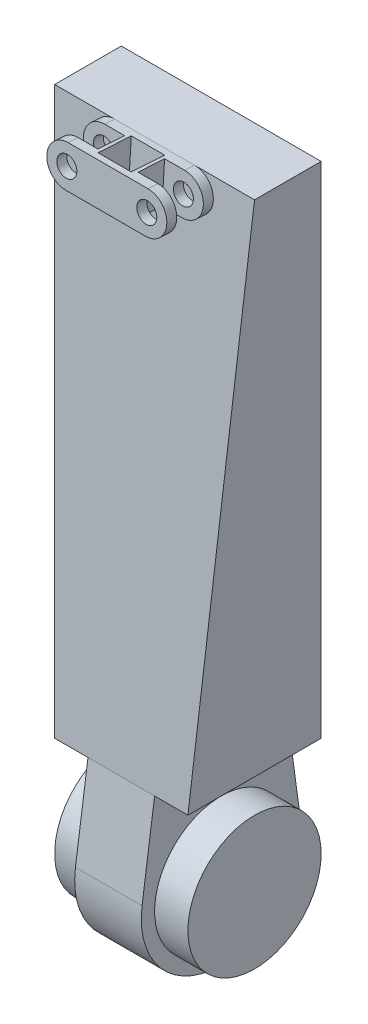
ISO-10303-21;
HEADER;
FILE_DESCRIPTION(('STEP AP214'),'2;1');
FILE_NAME('part.step','',(''),(''),'','','');
FILE_SCHEMA(('AUTOMOTIVE_DESIGN { 1 0 10303 214 1 1 1 1 }'));
ENDSEC;
DATA;
#1=APPLICATION_CONTEXT('core data for automotive mechanical design processes');
#2=APPLICATION_PROTOCOL_DEFINITION('international standard','automotive_design',2000,#1);
#3=PRODUCT_CONTEXT('',#1,'mechanical');
#4=PRODUCT('Part','Part','',(#3));
#5=PRODUCT_RELATED_PRODUCT_CATEGORY('part','',(#4));
#6=PRODUCT_DEFINITION_FORMATION('','',#4);
#7=PRODUCT_DEFINITION_CONTEXT('part definition',#1,'design');
#8=PRODUCT_DEFINITION('design','',#6,#7);
#9=PRODUCT_DEFINITION_SHAPE('','',#8);
#10=(LENGTH_UNIT() NAMED_UNIT(*) SI_UNIT(.MILLI.,.METRE.));
#11=(NAMED_UNIT(*) PLANE_ANGLE_UNIT() SI_UNIT($,.RADIAN.));
#12=(NAMED_UNIT(*) SI_UNIT($,.STERADIAN.) SOLID_ANGLE_UNIT());
#13=UNCERTAINTY_MEASURE_WITH_UNIT(LENGTH_MEASURE(1.E-05),#10,'distance_accuracy_value','');
#14=(GEOMETRIC_REPRESENTATION_CONTEXT(3) GLOBAL_UNCERTAINTY_ASSIGNED_CONTEXT((#13)) GLOBAL_UNIT_ASSIGNED_CONTEXT((#10,
#11,#12)) REPRESENTATION_CONTEXT('',''));
#15=CARTESIAN_POINT('',(0.,0.,0.));
#16=DIRECTION('',(0.,0.,1.));
#17=DIRECTION('',(1.,0.,0.));
#18=AXIS2_PLACEMENT_3D('',#15,#16,#17);
#19=CARTESIAN_POINT('',(6.,37.4424902676376,12.1735029078458));
#20=DIRECTION('',(0.,-0.0623782861551805,-0.998052578482889));
#21=DIRECTION('',(0.,0.998052578482889,-0.0623782861551805));
#22=AXIS2_PLACEMENT_3D('',#19,#20,#21);
#23=CYLINDRICAL_SURFACE('',#22,3.00000000000001);
#24=DIRECTION('',(0.,-0.0623782861551805,-0.998052578482889));
#25=VECTOR('',#24,1.);
#26=CARTESIAN_POINT('',(6.,34.4483325321889,12.3606377663113));
#27=LINE('',#26,#25);
#28=CARTESIAN_POINT('',(6.,34.4483325321889,12.3606377663113));
#29=VERTEX_POINT('',#28);
#30=CARTESIAN_POINT('',(6.,34.3547651029562,10.863558898587));
#31=VERTEX_POINT('',#30);
#32=EDGE_CURVE('E360',#29,#31,#27,.T.);
#33=ORIENTED_EDGE('',*,*,#32,.T.);
#34=CARTESIAN_POINT('',(6.,37.3489228384048,10.6764240401214));
#35=DIRECTION('',(0.,0.0623782861551805,0.998052578482889));
#36=DIRECTION('',(0.,-0.998052578482889,0.0623782861551805));
#37=AXIS2_PLACEMENT_3D('',#34,#35,#36);
#38=CIRCLE('',#37,3.00000000000001);
#39=CARTESIAN_POINT('',(6.,40.3430805738535,10.4892891816559));
#40=VERTEX_POINT('',#39);
#41=EDGE_CURVE('E323',#31,#40,#38,.T.);
#42=ORIENTED_EDGE('',*,*,#41,.T.);
#43=DIRECTION('',(0.,-0.0623782861551805,-0.998052578482889));
#44=VECTOR('',#43,1.);
#45=CARTESIAN_POINT('',(6.,40.4366480030863,11.9863680493802));
#46=LINE('',#45,#44);
#47=CARTESIAN_POINT('',(6.,40.4366480030863,11.9863680493802));
#48=VERTEX_POINT('',#47);
#49=EDGE_CURVE('E379',#48,#40,#46,.T.);
#50=ORIENTED_EDGE('',*,*,#49,.F.);
#51=CARTESIAN_POINT('',(6.,37.4424902676376,12.1735029078458));
#52=DIRECTION('',(0.,0.0623782861551805,0.998052578482889));
#53=DIRECTION('',(0.,-0.998052578482889,0.0623782861551805));
#54=AXIS2_PLACEMENT_3D('',#51,#52,#53);
#55=CIRCLE('',#54,3.00000000000001);
#56=EDGE_CURVE('E343',#29,#48,#55,.T.);
#57=ORIENTED_EDGE('',*,*,#56,.F.);
#58=EDGE_LOOP('',(#33,#42,#50,#57));
#59=FACE_BOUND('',#58,.T.);
#60=ADVANCED_FACE('F52',(#59),#23,.T.);
#61=CARTESIAN_POINT('',(-6.00000000000001,37.4424902676376,12.1735029078458));
#62=DIRECTION('',(0.,-0.0623782861551805,-0.998052578482889));
#63=DIRECTION('',(0.,0.998052578482889,-0.0623782861551805));
#64=AXIS2_PLACEMENT_3D('',#61,#62,#63);
#65=CYLINDRICAL_SURFACE('',#64,2.99999999999999);
#66=DIRECTION('',(0.,-0.0623782861551805,-0.998052578482889));
#67=VECTOR('',#66,1.);
#68=CARTESIAN_POINT('',(-6.00000000000001,34.4483325321889,12.3606377663113));
#69=LINE('',#68,#67);
#70=CARTESIAN_POINT('',(-6.00000000000001,34.1052519583355,6.87134858465542));
#71=VERTEX_POINT('',#70);
#72=CARTESIAN_POINT('',(-6.00000000000001,34.0116845291027,5.37426971693109));
#73=VERTEX_POINT('',#72);
#74=EDGE_CURVE('E364',#71,#73,#69,.T.);
#75=ORIENTED_EDGE('',*,*,#74,.F.);
#76=CARTESIAN_POINT('',(-6.00000000000001,37.0994096937841,6.68421372618988));
#77=DIRECTION('',(0.,-0.0623782861551805,-0.998052578482889));
#78=DIRECTION('',(0.,0.998052578482889,-0.0623782861551805));
#79=AXIS2_PLACEMENT_3D('',#76,#77,#78);
#80=CIRCLE('',#79,2.99999999999999);
#81=CARTESIAN_POINT('',(-6.,40.0935674292328,6.49707886772434));
#82=VERTEX_POINT('',#81);
#83=EDGE_CURVE('E331',#71,#82,#80,.T.);
#84=ORIENTED_EDGE('',*,*,#83,.T.);
#85=DIRECTION('',(0.,-0.0623782861551805,-0.998052578482889));
#86=VECTOR('',#85,1.);
#87=CARTESIAN_POINT('',(-6.00000000000001,40.4366480030863,11.9863680493802));
#88=LINE('',#87,#86);
#89=CARTESIAN_POINT('',(-6.00000000000001,40.,5.));
#90=VERTEX_POINT('',#89);
#91=EDGE_CURVE('E369',#82,#90,#88,.T.);
#92=ORIENTED_EDGE('',*,*,#91,.T.);
#93=CARTESIAN_POINT('',(-6.00000000000001,37.0058422645513,5.18713485846554));
#94=DIRECTION('',(0.,0.0623782861551805,0.998052578482889));
#95=DIRECTION('',(0.,-0.998052578482889,0.0623782861551805));
#96=AXIS2_PLACEMENT_3D('',#93,#94,#95);
#97=CIRCLE('',#96,2.99999999999999);
#98=EDGE_CURVE('E359',#90,#73,#97,.T.);
#99=ORIENTED_EDGE('',*,*,#98,.T.);
#100=EDGE_LOOP('',(#75,#84,#92,#99));
#101=FACE_BOUND('',#100,.T.);
#102=ADVANCED_FACE('F870',(#101),#65,.T.);
#103=CARTESIAN_POINT('',(6.,37.4424902676376,12.1735029078458));
#104=DIRECTION('',(0.,-0.0623782861551805,-0.998052578482889));
#105=DIRECTION('',(0.,0.998052578482889,-0.0623782861551805));
#106=AXIS2_PLACEMENT_3D('',#103,#104,#105);
#107=CYLINDRICAL_SURFACE('',#106,1.5);
#108=CARTESIAN_POINT('',(6.,37.3489228384048,10.6764240401214));
#109=DIRECTION('',(0.,0.0623782861551805,0.998052578482889));
#110=DIRECTION('',(0.,-0.998052578482889,0.0623782861551805));
#111=AXIS2_PLACEMENT_3D('',#108,#109,#110);
#112=CIRCLE('',#111,1.5);
#113=CARTESIAN_POINT('',(6.,35.8518439706805,10.7699914693542));
#114=VERTEX_POINT('',#113);
#115=EDGE_CURVE('E322',#114,#114,#112,.T.);
#116=ORIENTED_EDGE('',*,*,#115,.F.);
#117=EDGE_LOOP('',(#116));
#118=FACE_BOUND('',#117,.T.);
#119=CARTESIAN_POINT('',(6.,37.4424902676376,12.1735029078458));
#120=DIRECTION('',(0.,0.0623782861551805,0.998052578482889));
#121=DIRECTION('',(0.,-0.998052578482889,0.0623782861551805));
#122=AXIS2_PLACEMENT_3D('',#119,#120,#121);
#123=CIRCLE('',#122,1.5);
#124=CARTESIAN_POINT('',(6.,35.9454113999133,12.2670703370785));
#125=VERTEX_POINT('',#124);
#126=EDGE_CURVE('E334',#125,#125,#123,.T.);
#127=ORIENTED_EDGE('',*,*,#126,.T.);
#128=EDGE_LOOP('',(#127));
#129=FACE_BOUND('',#128,.T.);
#130=ADVANCED_FACE('F866',(#118,#129),#107,.F.);
#131=CARTESIAN_POINT('',(0.,-40.,0.));
#132=DIRECTION('',(0.,1.,0.));
#133=DIRECTION('',(0.,0.,1.));
#134=AXIS2_PLACEMENT_3D('',#131,#132,#133);
#135=PLANE('',#134);
#136=DIRECTION('',(0.,0.,1.));
#137=VECTOR('',#136,1.);
#138=CARTESIAN_POINT('',(5.,-40.,10.));
#139=LINE('',#138,#137);
#140=CARTESIAN_POINT('',(5.,-40.,-10.));
#141=VERTEX_POINT('',#140);
#142=CARTESIAN_POINT('',(5.,-40.,10.));
#143=VERTEX_POINT('',#142);
#144=EDGE_CURVE('E389',#141,#143,#139,.T.);
#145=ORIENTED_EDGE('',*,*,#144,.F.);
#146=DIRECTION('',(-1.,0.,0.));
#147=VECTOR('',#146,1.);
#148=CARTESIAN_POINT('',(-10.,-40.,-10.));
#149=LINE('',#148,#147);
#150=CARTESIAN_POINT('',(10.,-40.,-10.));
#151=VERTEX_POINT('',#150);
#152=EDGE_CURVE('E406',#151,#141,#149,.T.);
#153=ORIENTED_EDGE('',*,*,#152,.F.);
#154=DIRECTION('',(0.,0.,-1.));
#155=VECTOR('',#154,1.);
#156=CARTESIAN_POINT('',(10.,-40.,-10.));
#157=LINE('',#156,#155);
#158=CARTESIAN_POINT('',(10.,-40.,10.));
#159=VERTEX_POINT('',#158);
#160=EDGE_CURVE('E659',#159,#151,#157,.T.);
#161=ORIENTED_EDGE('',*,*,#160,.F.);
#162=DIRECTION('',(1.,0.,0.));
#163=VECTOR('',#162,1.);
#164=CARTESIAN_POINT('',(-10.,-40.,10.));
#165=LINE('',#164,#163);
#166=EDGE_CURVE('E533',#143,#159,#165,.T.);
#167=ORIENTED_EDGE('',*,*,#166,.F.);
#168=EDGE_LOOP('',(#145,#153,#161,#167));
#169=FACE_BOUND('',#168,.T.);
#170=ADVANCED_FACE('F1089',(#169),#135,.F.);
#171=CARTESIAN_POINT('',(-5.,-40.,-10.));
#172=VERTEX_POINT('',#171);
#173=CARTESIAN_POINT('',(-10.,-40.,-10.));
#174=VERTEX_POINT('',#173);
#175=EDGE_CURVE('E412',#172,#174,#149,.T.);
#176=ORIENTED_EDGE('',*,*,#175,.F.);
#177=DIRECTION('',(0.,0.,1.));
#178=VECTOR('',#177,1.);
#179=CARTESIAN_POINT('',(-5.,-40.,10.));
#180=LINE('',#179,#178);
#181=CARTESIAN_POINT('',(-5.,-40.,10.));
#182=VERTEX_POINT('',#181);
#183=EDGE_CURVE('E383',#172,#182,#180,.T.);
#184=ORIENTED_EDGE('',*,*,#183,.T.);
#185=CARTESIAN_POINT('',(-10.,-40.,10.));
#186=VERTEX_POINT('',#185);
#187=EDGE_CURVE('E667',#186,#182,#165,.T.);
#188=ORIENTED_EDGE('',*,*,#187,.F.);
#189=DIRECTION('',(0.,0.,1.));
#190=VECTOR('',#189,1.);
#191=CARTESIAN_POINT('',(-10.,-40.,-10.));
#192=LINE('',#191,#190);
#193=EDGE_CURVE('E429',#174,#186,#192,.T.);
#194=ORIENTED_EDGE('',*,*,#193,.F.);
#195=EDGE_LOOP('',(#176,#184,#188,#194));
#196=FACE_BOUND('',#195,.T.);
#197=ADVANCED_FACE('F54',(#196),#135,.F.);
#198=CARTESIAN_POINT('',(0.,40.,0.));
#199=DIRECTION('',(0.,1.,0.));
#200=DIRECTION('',(0.,0.,1.));
#201=AXIS2_PLACEMENT_3D('',#198,#199,#200);
#202=PLANE('',#201);
#203=DIRECTION('',(0.,0.,1.));
#204=VECTOR('',#203,1.);
#205=CARTESIAN_POINT('',(-15.,40.,5.));
#206=LINE('',#205,#204);
#207=CARTESIAN_POINT('',(-15.,40.,-5.));
#208=VERTEX_POINT('',#207);
#209=CARTESIAN_POINT('',(-15.,40.,5.));
#210=VERTEX_POINT('',#209);
#211=EDGE_CURVE('E402',#208,#210,#206,.T.);
#212=ORIENTED_EDGE('',*,*,#211,.T.);
#213=DIRECTION('',(1.,0.,0.));
#214=VECTOR('',#213,1.);
#215=CARTESIAN_POINT('',(15.,40.,5.));
#216=LINE('',#215,#214);
#217=EDGE_CURVE('E535',#210,#90,#216,.T.);
#218=ORIENTED_EDGE('',*,*,#217,.T.);
#219=DIRECTION('',(-1.,0.,0.));
#220=VECTOR('',#219,1.);
#221=CARTESIAN_POINT('',(6.,40.,5.));
#222=LINE('',#221,#220);
#223=CARTESIAN_POINT('',(6.,40.,5.));
#224=VERTEX_POINT('',#223);
#225=EDGE_CURVE('E586',#224,#90,#222,.T.);
#226=ORIENTED_EDGE('',*,*,#225,.F.);
#227=CARTESIAN_POINT('',(15.,40.,5.));
#228=VERTEX_POINT('',#227);
#229=EDGE_CURVE('E525',#224,#228,#216,.T.);
#230=ORIENTED_EDGE('',*,*,#229,.T.);
#231=DIRECTION('',(0.,0.,-1.));
#232=VECTOR('',#231,1.);
#233=CARTESIAN_POINT('',(15.,40.,5.));
#234=LINE('',#233,#232);
#235=CARTESIAN_POINT('',(15.,40.,-5.));
#236=VERTEX_POINT('',#235);
#237=EDGE_CURVE('E512',#228,#236,#234,.T.);
#238=ORIENTED_EDGE('',*,*,#237,.T.);
#239=DIRECTION('',(-1.,0.,0.));
#240=VECTOR('',#239,1.);
#241=CARTESIAN_POINT('',(15.,40.,-5.));
#242=LINE('',#241,#240);
#243=EDGE_CURVE('E526',#236,#208,#242,.T.);
#244=ORIENTED_EDGE('',*,*,#243,.T.);
#245=EDGE_LOOP('',(#212,#218,#226,#230,#238,#244));
#246=FACE_BOUND('',#245,.T.);
#247=ADVANCED_FACE('F716',(#246),#202,.T.);
#248=CARTESIAN_POINT('',(12.4513618677043,-0.778210116731518,0.));
#249=DIRECTION('',(0.998052578482889,-0.0623782861551806,0.));
#250=DIRECTION('',(0.0623782861551806,0.998052578482889,0.));
#251=AXIS2_PLACEMENT_3D('',#248,#249,#250);
#252=PLANE('',#251);
#253=DIRECTION('',(-0.0622572806364691,-0.996116490183505,0.062257280636469));
#254=VECTOR('',#253,1.);
#255=CARTESIAN_POINT('',(15.,40.,5.));
#256=LINE('',#255,#254);
#257=EDGE_CURVE('E505',#228,#159,#256,.T.);
#258=ORIENTED_EDGE('',*,*,#257,.T.);
#259=ORIENTED_EDGE('',*,*,#160,.T.);
#260=DIRECTION('',(-0.0622572806364691,-0.996116490183505,-0.062257280636469));
#261=VECTOR('',#260,1.);
#262=CARTESIAN_POINT('',(15.,40.,-5.));
#263=LINE('',#262,#261);
#264=EDGE_CURVE('E496',#236,#151,#263,.T.);
#265=ORIENTED_EDGE('',*,*,#264,.F.);
#266=ORIENTED_EDGE('',*,*,#237,.F.);
#267=EDGE_LOOP('',(#258,#259,#265,#266));
#268=FACE_BOUND('',#267,.T.);
#269=ADVANCED_FACE('F485',(#268),#252,.T.);
#270=CARTESIAN_POINT('',(0.,0.466926070038911,-7.47081712062257));
#271=DIRECTION('',(0.,0.0623782861551805,-0.998052578482889));
#272=DIRECTION('',(0.,0.998052578482889,0.0623782861551805));
#273=AXIS2_PLACEMENT_3D('',#270,#271,#272);
#274=PLANE('',#273);
#275=ORIENTED_EDGE('',*,*,#264,.T.);
#276=ORIENTED_EDGE('',*,*,#152,.T.);
#277=DIRECTION('',(-1.,0.,0.));
#278=VECTOR('',#277,1.);
#279=CARTESIAN_POINT('',(5.,-40.,-10.));
#280=LINE('',#279,#278);
#281=EDGE_CURVE('E434',#141,#172,#280,.T.);
#282=ORIENTED_EDGE('',*,*,#281,.T.);
#283=ORIENTED_EDGE('',*,*,#175,.T.);
#284=DIRECTION('',(0.062257280636469,-0.996116490183505,-0.0622572806364691));
#285=VECTOR('',#284,1.);
#286=CARTESIAN_POINT('',(-15.,40.,-5.));
#287=LINE('',#286,#285);
#288=EDGE_CURVE('E555',#208,#174,#287,.T.);
#289=ORIENTED_EDGE('',*,*,#288,.F.);
#290=ORIENTED_EDGE('',*,*,#243,.F.);
#291=EDGE_LOOP('',(#275,#276,#282,#283,#289,#290));
#292=FACE_BOUND('',#291,.T.);
#293=ADVANCED_FACE('F455',(#292),#274,.T.);
#294=CARTESIAN_POINT('',(0.,0.46692607003891,7.47081712062257));
#295=DIRECTION('',(0.,0.0623782861551805,0.998052578482889));
#296=DIRECTION('',(0.,-0.998052578482889,0.0623782861551805));
#297=AXIS2_PLACEMENT_3D('',#294,#295,#296);
#298=PLANE('',#297);
#299=ORIENTED_EDGE('',*,*,#229,.F.);
#300=CARTESIAN_POINT('',(6.,37.0058422645513,5.18713485846554));
#301=DIRECTION('',(0.,0.0623782861551805,0.998052578482889));
#302=DIRECTION('',(0.,-0.998052578482889,0.0623782861551805));
#303=AXIS2_PLACEMENT_3D('',#300,#301,#302);
#304=CIRCLE('',#303,3.00000000000001);
#305=CARTESIAN_POINT('',(6.,34.0116845291027,5.37426971693109));
#306=VERTEX_POINT('',#305);
#307=EDGE_CURVE('E342',#306,#224,#304,.T.);
#308=ORIENTED_EDGE('',*,*,#307,.F.);
#309=DIRECTION('',(1.,0.,0.));
#310=VECTOR('',#309,1.);
#311=CARTESIAN_POINT('',(6.,34.0116845291027,5.37426971693109));
#312=LINE('',#311,#310);
#313=EDGE_CURVE('E347',#73,#306,#312,.T.);
#314=ORIENTED_EDGE('',*,*,#313,.F.);
#315=ORIENTED_EDGE('',*,*,#98,.F.);
#316=ORIENTED_EDGE('',*,*,#217,.F.);
#317=DIRECTION('',(0.062257280636469,-0.996116490183505,0.062257280636469));
#318=VECTOR('',#317,1.);
#319=CARTESIAN_POINT('',(-15.,40.,5.));
#320=LINE('',#319,#318);
#321=EDGE_CURVE('E504',#210,#186,#320,.T.);
#322=ORIENTED_EDGE('',*,*,#321,.T.);
#323=ORIENTED_EDGE('',*,*,#187,.T.);
#324=DIRECTION('',(-1.,0.,0.));
#325=VECTOR('',#324,1.);
#326=CARTESIAN_POINT('',(5.,-40.,10.));
#327=LINE('',#326,#325);
#328=EDGE_CURVE('E398',#143,#182,#327,.T.);
#329=ORIENTED_EDGE('',*,*,#328,.F.);
#330=ORIENTED_EDGE('',*,*,#166,.T.);
#331=ORIENTED_EDGE('',*,*,#257,.F.);
#332=EDGE_LOOP('',(#299,#308,#314,#315,#316,#322,#323,#329,#330,#331));
#333=FACE_BOUND('',#332,.T.);
#334=ADVANCED_FACE('F484',(#333),#298,.T.);
#335=CARTESIAN_POINT('',(-12.4513618677043,-0.778210116731517,0.));
#336=DIRECTION('',(-0.998052578482889,-0.0623782861551805,0.));
#337=DIRECTION('',(0.0623782861551805,-0.998052578482889,0.));
#338=AXIS2_PLACEMENT_3D('',#335,#336,#337);
#339=PLANE('',#338);
#340=ORIENTED_EDGE('',*,*,#288,.T.);
#341=ORIENTED_EDGE('',*,*,#193,.T.);
#342=ORIENTED_EDGE('',*,*,#321,.F.);
#343=ORIENTED_EDGE('',*,*,#211,.F.);
#344=EDGE_LOOP('',(#340,#341,#342,#343));
#345=FACE_BOUND('',#344,.T.);
#346=ADVANCED_FACE('F556',(#345),#339,.T.);
#347=CARTESIAN_POINT('',(5.,-40.,10.));
#348=DIRECTION('',(0.,-0.13988849085927,-0.990167263711094));
#349=DIRECTION('',(0.,0.990167263711094,-0.13988849085927));
#350=AXIS2_PLACEMENT_3D('',#347,#348,#349);
#351=PLANE('',#350);
#352=DIRECTION('',(0.,-0.990167263711094,0.13988849085927));
#353=VECTOR('',#352,1.);
#354=CARTESIAN_POINT('',(-5.,-40.,10.));
#355=LINE('',#354,#353);
#356=CARTESIAN_POINT('',(-5.,-53.3213381096888,11.8820071645331));
#357=VERTEX_POINT('',#356);
#358=EDGE_CURVE('E694',#182,#357,#355,.T.);
#359=ORIENTED_EDGE('',*,*,#358,.T.);
#360=DIRECTION('',(-1.,0.,0.));
#361=VECTOR('',#360,1.);
#362=CARTESIAN_POINT('',(5.,-53.3213381096888,11.8820071645331));
#363=LINE('',#362,#361);
#364=CARTESIAN_POINT('',(5.,-53.3213381096888,11.8820071645331));
#365=VERTEX_POINT('',#364);
#366=EDGE_CURVE('E403',#365,#357,#363,.T.);
#367=ORIENTED_EDGE('',*,*,#366,.F.);
#368=DIRECTION('',(0.,-0.990167263711094,0.13988849085927));
#369=VECTOR('',#368,1.);
#370=CARTESIAN_POINT('',(5.,-40.,10.));
#371=LINE('',#370,#369);
#372=EDGE_CURVE('E394',#143,#365,#371,.T.);
#373=ORIENTED_EDGE('',*,*,#372,.F.);
#374=ORIENTED_EDGE('',*,*,#328,.T.);
#375=EDGE_LOOP('',(#359,#367,#373,#374));
#376=FACE_BOUND('',#375,.T.);
#377=ADVANCED_FACE('F564',(#376),#351,.F.);
#378=CARTESIAN_POINT('',(5.,-55.,0.));
#379=DIRECTION('',(-1.,0.,0.));
#380=DIRECTION('',(0.,0.,1.));
#381=AXIS2_PLACEMENT_3D('',#378,#379,#380);
#382=CYLINDRICAL_SURFACE('',#381,12.);
#383=CARTESIAN_POINT('',(-5.,-55.,0.));
#384=DIRECTION('',(1.,0.,0.));
#385=DIRECTION('',(0.,0.,-1.));
#386=AXIS2_PLACEMENT_3D('',#383,#384,#385);
#387=CIRCLE('',#386,12.);
#388=CARTESIAN_POINT('',(-5.,-52.0894958776771,-11.6416908460043));
#389=VERTEX_POINT('',#388);
#390=EDGE_CURVE('E697',#357,#389,#387,.T.);
#391=ORIENTED_EDGE('',*,*,#390,.T.);
#392=DIRECTION('',(-1.,0.,0.));
#393=VECTOR('',#392,1.);
#394=CARTESIAN_POINT('',(5.,-52.0894958776771,-11.6416908460043));
#395=LINE('',#394,#393);
#396=CARTESIAN_POINT('',(5.,-52.0894958776771,-11.6416908460043));
#397=VERTEX_POINT('',#396);
#398=EDGE_CURVE('E439',#397,#389,#395,.T.);
#399=ORIENTED_EDGE('',*,*,#398,.F.);
#400=CARTESIAN_POINT('',(5.,-55.,0.));
#401=DIRECTION('',(1.,0.,0.));
#402=DIRECTION('',(0.,0.,-1.));
#403=AXIS2_PLACEMENT_3D('',#400,#401,#402);
#404=CIRCLE('',#403,12.);
#405=EDGE_CURVE('E386',#365,#397,#404,.T.);
#406=ORIENTED_EDGE('',*,*,#405,.F.);
#407=ORIENTED_EDGE('',*,*,#366,.T.);
#408=EDGE_LOOP('',(#391,#399,#406,#407));
#409=FACE_BOUND('',#408,.T.);
#410=ADVANCED_FACE('F715',(#409),#382,.T.);
#411=CARTESIAN_POINT('',(5.,-40.,-10.));
#412=DIRECTION('',(0.,-0.13455982436795,0.990905471609712));
#413=DIRECTION('',(0.,-0.990905471609712,-0.13455982436795));
#414=AXIS2_PLACEMENT_3D('',#411,#412,#413);
#415=PLANE('',#414);
#416=DIRECTION('',(0.,0.990905471609712,0.13455982436795));
#417=VECTOR('',#416,1.);
#418=CARTESIAN_POINT('',(-5.,-40.,-10.));
#419=LINE('',#418,#417);
#420=EDGE_CURVE('E395',#389,#172,#419,.T.);
#421=ORIENTED_EDGE('',*,*,#420,.T.);
#422=ORIENTED_EDGE('',*,*,#281,.F.);
#423=DIRECTION('',(0.,0.990905471609712,0.13455982436795));
#424=VECTOR('',#423,1.);
#425=CARTESIAN_POINT('',(5.,-40.,-10.));
#426=LINE('',#425,#424);
#427=EDGE_CURVE('E413',#397,#141,#426,.T.);
#428=ORIENTED_EDGE('',*,*,#427,.F.);
#429=ORIENTED_EDGE('',*,*,#398,.T.);
#430=EDGE_LOOP('',(#421,#422,#428,#429));
#431=FACE_BOUND('',#430,.T.);
#432=ADVANCED_FACE('F447',(#431),#415,.F.);
#433=CARTESIAN_POINT('',(5.,-55.,0.));
#434=DIRECTION('',(1.,0.,0.));
#435=DIRECTION('',(0.,0.,-1.));
#436=AXIS2_PLACEMENT_3D('',#433,#434,#435);
#437=PLANE('',#436);
#438=CARTESIAN_POINT('',(5.,-55.,0.));
#439=DIRECTION('',(1.,0.,0.));
#440=DIRECTION('',(0.,0.,-1.));
#441=AXIS2_PLACEMENT_3D('',#438,#439,#440);
#442=CIRCLE('',#441,10.);
#443=CARTESIAN_POINT('',(5.,-55.,-10.));
#444=VERTEX_POINT('',#443);
#445=EDGE_CURVE('E374',#444,#444,#442,.F.);
#446=ORIENTED_EDGE('',*,*,#445,.T.);
#447=EDGE_LOOP('',(#446));
#448=FACE_BOUND('',#447,.T.);
#449=ORIENTED_EDGE('',*,*,#144,.T.);
#450=ORIENTED_EDGE('',*,*,#372,.T.);
#451=ORIENTED_EDGE('',*,*,#405,.T.);
#452=ORIENTED_EDGE('',*,*,#427,.T.);
#453=EDGE_LOOP('',(#449,#450,#451,#452));
#454=FACE_BOUND('',#453,.T.);
#455=ADVANCED_FACE('F1169',(#448,#454),#437,.T.);
#456=CARTESIAN_POINT('',(-5.,-55.,0.));
#457=DIRECTION('',(1.,0.,0.));
#458=DIRECTION('',(0.,0.,-1.));
#459=AXIS2_PLACEMENT_3D('',#456,#457,#458);
#460=PLANE('',#459);
#461=CARTESIAN_POINT('',(-5.,-55.,0.));
#462=DIRECTION('',(1.,0.,0.));
#463=DIRECTION('',(0.,0.,-1.));
#464=AXIS2_PLACEMENT_3D('',#461,#462,#463);
#465=CIRCLE('',#464,10.);
#466=CARTESIAN_POINT('',(-5.,-55.,-10.));
#467=VERTEX_POINT('',#466);
#468=EDGE_CURVE('E411',#467,#467,#465,.F.);
#469=ORIENTED_EDGE('',*,*,#468,.F.);
#470=EDGE_LOOP('',(#469));
#471=FACE_BOUND('',#470,.T.);
#472=ORIENTED_EDGE('',*,*,#183,.F.);
#473=ORIENTED_EDGE('',*,*,#420,.F.);
#474=ORIENTED_EDGE('',*,*,#390,.F.);
#475=ORIENTED_EDGE('',*,*,#358,.F.);
#476=EDGE_LOOP('',(#472,#473,#474,#475));
#477=FACE_BOUND('',#476,.T.);
#478=ADVANCED_FACE('F1159',(#471,#477),#460,.F.);
#479=CARTESIAN_POINT('',(-10.,-55.,0.));
#480=DIRECTION('',(1.,0.,0.));
#481=DIRECTION('',(0.,0.,-1.));
#482=AXIS2_PLACEMENT_3D('',#479,#480,#481);
#483=PLANE('',#482);
#484=CARTESIAN_POINT('',(-10.,-55.,0.));
#485=DIRECTION('',(1.,0.,0.));
#486=DIRECTION('',(0.,0.,-1.));
#487=AXIS2_PLACEMENT_3D('',#484,#485,#486);
#488=CIRCLE('',#487,10.);
#489=CARTESIAN_POINT('',(-10.,-55.,-10.));
#490=VERTEX_POINT('',#489);
#491=EDGE_CURVE('E375',#490,#490,#488,.T.);
#492=ORIENTED_EDGE('',*,*,#491,.F.);
#493=EDGE_LOOP('',(#492));
#494=FACE_BOUND('',#493,.T.);
#495=ADVANCED_FACE('F1150',(#494),#483,.F.);
#496=CARTESIAN_POINT('',(10.,-55.,0.));
#497=DIRECTION('',(-1.,0.,0.));
#498=DIRECTION('',(0.,0.,1.));
#499=AXIS2_PLACEMENT_3D('',#496,#497,#498);
#500=CYLINDRICAL_SURFACE('',#499,10.);
#501=ORIENTED_EDGE('',*,*,#491,.T.);
#502=EDGE_LOOP('',(#501));
#503=FACE_BOUND('',#502,.T.);
#504=ORIENTED_EDGE('',*,*,#468,.T.);
#505=EDGE_LOOP('',(#504));
#506=FACE_BOUND('',#505,.T.);
#507=ADVANCED_FACE('F1140',(#503,#506),#500,.T.);
#508=ORIENTED_EDGE('',*,*,#445,.F.);
#509=EDGE_LOOP('',(#508));
#510=FACE_BOUND('',#509,.T.);
#511=CARTESIAN_POINT('',(10.,-55.,0.));
#512=DIRECTION('',(1.,0.,0.));
#513=DIRECTION('',(0.,0.,-1.));
#514=AXIS2_PLACEMENT_3D('',#511,#512,#513);
#515=CIRCLE('',#514,10.);
#516=CARTESIAN_POINT('',(10.,-55.,-10.));
#517=VERTEX_POINT('',#516);
#518=EDGE_CURVE('E370',#517,#517,#515,.T.);
#519=ORIENTED_EDGE('',*,*,#518,.F.);
#520=EDGE_LOOP('',(#519));
#521=FACE_BOUND('',#520,.T.);
#522=ADVANCED_FACE('F1130',(#510,#521),#500,.T.);
#523=CARTESIAN_POINT('',(10.,-55.,0.));
#524=DIRECTION('',(1.,0.,0.));
#525=DIRECTION('',(0.,0.,-1.));
#526=AXIS2_PLACEMENT_3D('',#523,#524,#525);
#527=PLANE('',#526);
#528=ORIENTED_EDGE('',*,*,#518,.T.);
#529=EDGE_LOOP('',(#528));
#530=FACE_BOUND('',#529,.T.);
#531=ADVANCED_FACE('F887',(#530),#527,.T.);
#532=CARTESIAN_POINT('',(6.,37.4424902676376,12.1735029078458));
#533=DIRECTION('',(0.,0.0623782861551805,0.998052578482889));
#534=DIRECTION('',(0.,-0.998052578482889,0.0623782861551805));
#535=AXIS2_PLACEMENT_3D('',#532,#533,#534);
#536=PLANE('',#535);
#537=CARTESIAN_POINT('',(-6.00000000000001,37.4424902676376,12.1735029078458));
#538=DIRECTION('',(0.,0.0623782861551805,0.998052578482889));
#539=DIRECTION('',(0.,-0.998052578482889,0.0623782861551805));
#540=AXIS2_PLACEMENT_3D('',#537,#538,#539);
#541=CIRCLE('',#540,1.5);
#542=CARTESIAN_POINT('',(-6.00000000000001,35.9454113999133,12.2670703370785));
#543=VERTEX_POINT('',#542);
#544=EDGE_CURVE('E338',#543,#543,#541,.T.);
#545=ORIENTED_EDGE('',*,*,#544,.F.);
#546=EDGE_LOOP('',(#545));
#547=FACE_BOUND('',#546,.T.);
#548=ORIENTED_EDGE('',*,*,#56,.T.);
#549=DIRECTION('',(-1.,0.,0.));
#550=VECTOR('',#549,1.);
#551=CARTESIAN_POINT('',(6.,40.4366480030863,11.9863680493802));
#552=LINE('',#551,#550);
#553=CARTESIAN_POINT('',(-6.00000000000001,40.4366480030863,11.9863680493802));
#554=VERTEX_POINT('',#553);
#555=EDGE_CURVE('E346',#48,#554,#552,.T.);
#556=ORIENTED_EDGE('',*,*,#555,.T.);
#557=CARTESIAN_POINT('',(-6.00000000000001,37.4424902676376,12.1735029078458));
#558=DIRECTION('',(0.,0.0623782861551805,0.998052578482889));
#559=DIRECTION('',(0.,-0.998052578482889,0.0623782861551805));
#560=AXIS2_PLACEMENT_3D('',#557,#558,#559);
#561=CIRCLE('',#560,2.99999999999999);
#562=CARTESIAN_POINT('',(-6.00000000000001,34.4483325321889,12.3606377663113));
#563=VERTEX_POINT('',#562);
#564=EDGE_CURVE('E349',#554,#563,#561,.T.);
#565=ORIENTED_EDGE('',*,*,#564,.T.);
#566=DIRECTION('',(1.,0.,0.));
#567=VECTOR('',#566,1.);
#568=CARTESIAN_POINT('',(6.,34.4483325321889,12.3606377663113));
#569=LINE('',#568,#567);
#570=EDGE_CURVE('E352',#563,#29,#569,.T.);
#571=ORIENTED_EDGE('',*,*,#570,.T.);
#572=EDGE_LOOP('',(#548,#556,#565,#571));
#573=FACE_BOUND('',#572,.T.);
#574=ORIENTED_EDGE('',*,*,#126,.F.);
#575=EDGE_LOOP('',(#574));
#576=FACE_BOUND('',#575,.T.);
#577=ADVANCED_FACE('F882',(#547,#573,#576),#536,.T.);
#578=CARTESIAN_POINT('',(6.,40.0935674292328,6.49707886772434));
#579=VERTEX_POINT('',#578);
#580=EDGE_CURVE('E57',#579,#224,#46,.T.);
#581=ORIENTED_EDGE('',*,*,#580,.F.);
#582=CARTESIAN_POINT('',(6.,37.0994096937841,6.68421372618988));
#583=DIRECTION('',(0.,-0.0623782861551805,-0.998052578482889));
#584=DIRECTION('',(0.,0.998052578482889,-0.0623782861551805));
#585=AXIS2_PLACEMENT_3D('',#582,#583,#584);
#586=CIRCLE('',#585,3.00000000000001);
#587=CARTESIAN_POINT('',(6.,34.1052519583355,6.87134858465542));
#588=VERTEX_POINT('',#587);
#589=EDGE_CURVE('E319',#579,#588,#586,.T.);
#590=ORIENTED_EDGE('',*,*,#589,.T.);
#591=EDGE_CURVE('E355',#588,#306,#27,.T.);
#592=ORIENTED_EDGE('',*,*,#591,.T.);
#593=ORIENTED_EDGE('',*,*,#307,.T.);
#594=EDGE_LOOP('',(#581,#590,#592,#593));
#595=FACE_BOUND('',#594,.T.);
#596=ADVANCED_FACE('F873',(#595),#23,.T.);
#597=CARTESIAN_POINT('',(6.,40.4366480030863,11.9863680493802));
#598=DIRECTION('',(0.,-0.998052578482889,0.0623782861551805));
#599=DIRECTION('',(0.,-0.0623782861551805,-0.998052578482889));
#600=AXIS2_PLACEMENT_3D('',#597,#598,#599);
#601=PLANE('',#600);
#602=DIRECTION('',(-1.,0.,0.));
#603=VECTOR('',#602,1.);
#604=CARTESIAN_POINT('',(-2.50000000000009,40.0623782861552,5.9980525784829));
#605=LINE('',#604,#603);
#606=CARTESIAN_POINT('',(2.49999999999992,40.0623782861552,5.9980525784829));
#607=VERTEX_POINT('',#606);
#608=CARTESIAN_POINT('',(-2.50000000000009,40.0623782861552,5.9980525784829));
#609=VERTEX_POINT('',#608);
#610=EDGE_CURVE('E231',#607,#609,#605,.T.);
#611=ORIENTED_EDGE('',*,*,#610,.F.);
#612=DIRECTION('',(0.,-0.0623782861551805,-0.998052578482889));
#613=VECTOR('',#612,1.);
#614=CARTESIAN_POINT('',(2.49999999999991,40.3742697169311,10.9883154708973));
#615=LINE('',#614,#613);
#616=CARTESIAN_POINT('',(2.49999999999991,40.3742697169311,10.9883154708973));
#617=VERTEX_POINT('',#616);
#618=EDGE_CURVE('E72',#617,#607,#615,.T.);
#619=ORIENTED_EDGE('',*,*,#618,.F.);
#620=DIRECTION('',(1.,0.,0.));
#621=VECTOR('',#620,1.);
#622=CARTESIAN_POINT('',(-2.50000000000009,40.3742697169311,10.9883154708973));
#623=LINE('',#622,#621);
#624=CARTESIAN_POINT('',(-2.50000000000009,40.3742697169311,10.9883154708973));
#625=VERTEX_POINT('',#624);
#626=EDGE_CURVE('E239',#625,#617,#623,.T.);
#627=ORIENTED_EDGE('',*,*,#626,.F.);
#628=DIRECTION('',(0.,0.0623782861551805,0.998052578482889));
#629=VECTOR('',#628,1.);
#630=CARTESIAN_POINT('',(-2.50000000000009,40.3742697169311,10.9883154708973));
#631=LINE('',#630,#629);
#632=EDGE_CURVE('E221',#609,#625,#631,.T.);
#633=ORIENTED_EDGE('',*,*,#632,.F.);
#634=EDGE_LOOP('',(#611,#619,#627,#633));
#635=FACE_BOUND('',#634,.T.);
#636=ORIENTED_EDGE('',*,*,#49,.T.);
#637=DIRECTION('',(1.,0.,0.));
#638=VECTOR('',#637,1.);
#639=CARTESIAN_POINT('',(2.99999999999999,40.3430805738535,10.4892891816559));
#640=LINE('',#639,#638);
#641=CARTESIAN_POINT('',(2.99999999999999,40.3430805738535,10.4892891816559));
#642=VERTEX_POINT('',#641);
#643=EDGE_CURVE('E278',#642,#40,#640,.T.);
#644=ORIENTED_EDGE('',*,*,#643,.F.);
#645=DIRECTION('',(0.,0.0623782861551812,0.998052578482888));
#646=VECTOR('',#645,1.);
#647=CARTESIAN_POINT('',(2.99999999999999,40.3430805738535,10.4892891816559));
#648=LINE('',#647,#646);
#649=CARTESIAN_POINT('',(2.99999999999999,40.0935674292328,6.49707886772434));
#650=VERTEX_POINT('',#649);
#651=EDGE_CURVE('E273',#650,#642,#648,.T.);
#652=ORIENTED_EDGE('',*,*,#651,.F.);
#653=DIRECTION('',(-1.,0.,0.));
#654=VECTOR('',#653,1.);
#655=CARTESIAN_POINT('',(2.99999999999999,40.0935674292328,6.49707886772434));
#656=LINE('',#655,#654);
#657=EDGE_CURVE('E270',#579,#650,#656,.T.);
#658=ORIENTED_EDGE('',*,*,#657,.F.);
#659=ORIENTED_EDGE('',*,*,#580,.T.);
#660=ORIENTED_EDGE('',*,*,#225,.T.);
#661=ORIENTED_EDGE('',*,*,#91,.F.);
#662=DIRECTION('',(-1.,0.,0.));
#663=VECTOR('',#662,1.);
#664=CARTESIAN_POINT('',(-3.00000000000002,40.0935674292328,6.49707886772434));
#665=LINE('',#664,#663);
#666=CARTESIAN_POINT('',(-3.00000000000002,40.0935674292328,6.49707886772434));
#667=VERTEX_POINT('',#666);
#668=EDGE_CURVE('E306',#667,#82,#665,.T.);
#669=ORIENTED_EDGE('',*,*,#668,.F.);
#670=DIRECTION('',(0.,-0.0623782861551812,-0.998052578482889));
#671=VECTOR('',#670,1.);
#672=CARTESIAN_POINT('',(-3.00000000000002,40.3430805738535,10.4892891816559));
#673=LINE('',#672,#671);
#674=CARTESIAN_POINT('',(-3.00000000000002,40.3430805738535,10.4892891816559));
#675=VERTEX_POINT('',#674);
#676=EDGE_CURVE('E302',#675,#667,#673,.T.);
#677=ORIENTED_EDGE('',*,*,#676,.F.);
#678=DIRECTION('',(1.,0.,0.));
#679=VECTOR('',#678,1.);
#680=CARTESIAN_POINT('',(-3.00000000000002,40.3430805738535,10.4892891816559));
#681=LINE('',#680,#679);
#682=CARTESIAN_POINT('',(-6.,40.3430805738535,10.4892891816559));
#683=VERTEX_POINT('',#682);
#684=EDGE_CURVE('E259',#683,#675,#681,.T.);
#685=ORIENTED_EDGE('',*,*,#684,.F.);
#686=EDGE_CURVE('E602',#554,#683,#88,.T.);
#687=ORIENTED_EDGE('',*,*,#686,.F.);
#688=ORIENTED_EDGE('',*,*,#555,.F.);
#689=EDGE_LOOP('',(#636,#644,#652,#658,#659,#660,#661,#669,#677,#685,#687,#688));
#690=FACE_BOUND('',#689,.T.);
#691=ADVANCED_FACE('F236',(#635,#690),#601,.F.);
#692=ORIENTED_EDGE('',*,*,#686,.T.);
#693=CARTESIAN_POINT('',(-6.00000000000001,37.3489228384048,10.6764240401214));
#694=DIRECTION('',(0.,0.0623782861551805,0.998052578482889));
#695=DIRECTION('',(0.,-0.998052578482889,0.0623782861551805));
#696=AXIS2_PLACEMENT_3D('',#693,#694,#695);
#697=CIRCLE('',#696,2.99999999999999);
#698=CARTESIAN_POINT('',(-6.00000000000001,34.3547651029562,10.863558898587));
#699=VERTEX_POINT('',#698);
#700=EDGE_CURVE('E327',#683,#699,#697,.T.);
#701=ORIENTED_EDGE('',*,*,#700,.T.);
#702=EDGE_CURVE('E365',#563,#699,#69,.T.);
#703=ORIENTED_EDGE('',*,*,#702,.F.);
#704=ORIENTED_EDGE('',*,*,#564,.F.);
#705=EDGE_LOOP('',(#692,#701,#703,#704));
#706=FACE_BOUND('',#705,.T.);
#707=ADVANCED_FACE('F878',(#706),#65,.T.);
#708=CARTESIAN_POINT('',(6.,34.4483325321889,12.3606377663113));
#709=DIRECTION('',(0.,0.998052578482889,-0.0623782861551805));
#710=DIRECTION('',(0.,0.0623782861551805,0.998052578482889));
#711=AXIS2_PLACEMENT_3D('',#708,#709,#710);
#712=PLANE('',#711);
#713=DIRECTION('',(-1.,0.,0.));
#714=VECTOR('',#713,1.);
#715=CARTESIAN_POINT('',(-2.50000000000007,34.3859542460338,11.3625851878284));
#716=LINE('',#715,#714);
#717=CARTESIAN_POINT('',(2.49999999999993,34.3859542460338,11.3625851878284));
#718=VERTEX_POINT('',#717);
#719=CARTESIAN_POINT('',(-2.50000000000008,34.3859542460338,11.3625851878284));
#720=VERTEX_POINT('',#719);
#721=EDGE_CURVE('E841',#718,#720,#716,.T.);
#722=ORIENTED_EDGE('',*,*,#721,.F.);
#723=DIRECTION('',(0.,0.0623782861551805,0.998052578482889));
#724=VECTOR('',#723,1.);
#725=CARTESIAN_POINT('',(2.49999999999992,34.3859542460338,11.3625851878284));
#726=LINE('',#725,#724);
#727=CARTESIAN_POINT('',(2.49999999999992,34.0740628152579,6.37232229541398));
#728=VERTEX_POINT('',#727);
#729=EDGE_CURVE('E260',#728,#718,#726,.T.);
#730=ORIENTED_EDGE('',*,*,#729,.F.);
#731=DIRECTION('',(1.,0.,0.));
#732=VECTOR('',#731,1.);
#733=CARTESIAN_POINT('',(-2.50000000000007,34.0740628152579,6.37232229541398));
#734=LINE('',#733,#732);
#735=CARTESIAN_POINT('',(-2.50000000000009,34.0740628152579,6.37232229541398));
#736=VERTEX_POINT('',#735);
#737=EDGE_CURVE('E256',#736,#728,#734,.T.);
#738=ORIENTED_EDGE('',*,*,#737,.F.);
#739=DIRECTION('',(0.,-0.0623782861551805,-0.998052578482889));
#740=VECTOR('',#739,1.);
#741=CARTESIAN_POINT('',(-2.50000000000008,34.3859542460338,11.3625851878284));
#742=LINE('',#741,#740);
#743=EDGE_CURVE('E224',#720,#736,#742,.T.);
#744=ORIENTED_EDGE('',*,*,#743,.F.);
#745=EDGE_LOOP('',(#722,#730,#738,#744));
#746=FACE_BOUND('',#745,.T.);
#747=DIRECTION('',(0.,-0.0623782861551805,-0.998052578482889));
#748=VECTOR('',#747,1.);
#749=CARTESIAN_POINT('',(2.99999999999999,34.3547651029562,10.863558898587));
#750=LINE('',#749,#748);
#751=CARTESIAN_POINT('',(2.99999999999999,34.3547651029562,10.863558898587));
#752=VERTEX_POINT('',#751);
#753=CARTESIAN_POINT('',(2.99999999999999,34.1052519583355,6.87134858465542));
#754=VERTEX_POINT('',#753);
#755=EDGE_CURVE('E261',#752,#754,#750,.T.);
#756=ORIENTED_EDGE('',*,*,#755,.F.);
#757=DIRECTION('',(-1.,0.,0.));
#758=VECTOR('',#757,1.);
#759=CARTESIAN_POINT('',(2.99999999999999,34.3547651029562,10.863558898587));
#760=LINE('',#759,#758);
#761=EDGE_CURVE('E265',#31,#752,#760,.T.);
#762=ORIENTED_EDGE('',*,*,#761,.F.);
#763=ORIENTED_EDGE('',*,*,#32,.F.);
#764=ORIENTED_EDGE('',*,*,#570,.F.);
#765=ORIENTED_EDGE('',*,*,#702,.T.);
#766=DIRECTION('',(-1.,0.,0.));
#767=VECTOR('',#766,1.);
#768=CARTESIAN_POINT('',(-3.00000000000001,34.3547651029562,10.863558898587));
#769=LINE('',#768,#767);
#770=CARTESIAN_POINT('',(-3.00000000000002,34.3547651029562,10.863558898587));
#771=VERTEX_POINT('',#770);
#772=EDGE_CURVE('E274',#771,#699,#769,.T.);
#773=ORIENTED_EDGE('',*,*,#772,.F.);
#774=DIRECTION('',(0.,0.0623782861551805,0.998052578482889));
#775=VECTOR('',#774,1.);
#776=CARTESIAN_POINT('',(-3.00000000000002,34.3547651029562,10.863558898587));
#777=LINE('',#776,#775);
#778=CARTESIAN_POINT('',(-3.00000000000002,34.1052519583355,6.87134858465542));
#779=VERTEX_POINT('',#778);
#780=EDGE_CURVE('E292',#779,#771,#777,.T.);
#781=ORIENTED_EDGE('',*,*,#780,.F.);
#782=DIRECTION('',(1.,0.,0.));
#783=VECTOR('',#782,1.);
#784=CARTESIAN_POINT('',(-3.00000000000001,34.1052519583355,6.87134858465542));
#785=LINE('',#784,#783);
#786=EDGE_CURVE('E296',#71,#779,#785,.T.);
#787=ORIENTED_EDGE('',*,*,#786,.F.);
#788=ORIENTED_EDGE('',*,*,#74,.T.);
#789=ORIENTED_EDGE('',*,*,#313,.T.);
#790=ORIENTED_EDGE('',*,*,#591,.F.);
#791=DIRECTION('',(1.,0.,0.));
#792=VECTOR('',#791,1.);
#793=CARTESIAN_POINT('',(2.99999999999999,34.1052519583355,6.87134858465542));
#794=LINE('',#793,#792);
#795=EDGE_CURVE('E269',#754,#588,#794,.T.);
#796=ORIENTED_EDGE('',*,*,#795,.F.);
#797=EDGE_LOOP('',(#756,#762,#763,#764,#765,#773,#781,#787,#788,#789,#790,#796));
#798=FACE_BOUND('',#797,.T.);
#799=ADVANCED_FACE('F852',(#746,#798),#712,.F.);
#800=CARTESIAN_POINT('',(-6.00000000000001,37.4424902676376,12.1735029078458));
#801=DIRECTION('',(0.,-0.0623782861551805,-0.998052578482889));
#802=DIRECTION('',(0.,0.998052578482889,-0.0623782861551805));
#803=AXIS2_PLACEMENT_3D('',#800,#801,#802);
#804=CYLINDRICAL_SURFACE('',#803,1.5);
#805=CARTESIAN_POINT('',(-6.00000000000001,37.3489228384048,10.6764240401214));
#806=DIRECTION('',(0.,0.0623782861551805,0.998052578482889));
#807=DIRECTION('',(0.,-0.998052578482889,0.0623782861551805));
#808=AXIS2_PLACEMENT_3D('',#805,#806,#807);
#809=CIRCLE('',#808,1.5);
#810=CARTESIAN_POINT('',(-6.00000000000001,35.8518439706805,10.7699914693542));
#811=VERTEX_POINT('',#810);
#812=EDGE_CURVE('E326',#811,#811,#809,.T.);
#813=ORIENTED_EDGE('',*,*,#812,.F.);
#814=EDGE_LOOP('',(#813));
#815=FACE_BOUND('',#814,.T.);
#816=ORIENTED_EDGE('',*,*,#544,.T.);
#817=EDGE_LOOP('',(#816));
#818=FACE_BOUND('',#817,.T.);
#819=ADVANCED_FACE('F928',(#815,#818),#804,.F.);
#820=CARTESIAN_POINT('',(2.99999999999999,27.157705608298,11.3133751170031));
#821=DIRECTION('',(0.,0.0623782861551805,0.998052578482889));
#822=DIRECTION('',(0.,-0.998052578482889,0.0623782861551805));
#823=AXIS2_PLACEMENT_3D('',#820,#821,#822);
#824=PLANE('',#823);
#825=ORIENTED_EDGE('',*,*,#115,.T.);
#826=EDGE_LOOP('',(#825));
#827=FACE_BOUND('',#826,.T.);
#828=ORIENTED_EDGE('',*,*,#761,.T.);
#829=DIRECTION('',(0.,0.998052578482889,-0.0623782861551805));
#830=VECTOR('',#829,1.);
#831=CARTESIAN_POINT('',(2.99999999999999,27.157705608298,11.3133751170031));
#832=LINE('',#831,#830);
#833=EDGE_CURVE('E266',#752,#642,#832,.T.);
#834=ORIENTED_EDGE('',*,*,#833,.T.);
#835=ORIENTED_EDGE('',*,*,#643,.T.);
#836=ORIENTED_EDGE('',*,*,#41,.F.);
#837=EDGE_LOOP('',(#828,#834,#835,#836));
#838=FACE_BOUND('',#837,.T.);
#839=ADVANCED_FACE('F926',(#827,#838),#824,.F.);
#840=CARTESIAN_POINT('',(2.99999999999999,26.9081924636772,7.32116480307156));
#841=DIRECTION('',(0.,-0.0623782861551805,-0.998052578482889));
#842=DIRECTION('',(0.,0.998052578482889,-0.0623782861551805));
#843=AXIS2_PLACEMENT_3D('',#840,#841,#842);
#844=PLANE('',#843);
#845=CARTESIAN_POINT('',(6.,37.0994096937841,6.68421372618988));
#846=DIRECTION('',(0.,-0.0623782861551805,-0.998052578482889));
#847=DIRECTION('',(0.,0.998052578482889,-0.0623782861551805));
#848=AXIS2_PLACEMENT_3D('',#845,#846,#847);
#849=CIRCLE('',#848,1.5);
#850=CARTESIAN_POINT('',(6.,38.5964885615085,6.59064629695711));
#851=VERTEX_POINT('',#850);
#852=EDGE_CURVE('E291',#851,#851,#849,.T.);
#853=ORIENTED_EDGE('',*,*,#852,.T.);
#854=EDGE_LOOP('',(#853));
#855=FACE_BOUND('',#854,.T.);
#856=ORIENTED_EDGE('',*,*,#657,.T.);
#857=DIRECTION('',(0.,0.998052578482889,-0.0623782861551805));
#858=VECTOR('',#857,1.);
#859=CARTESIAN_POINT('',(2.99999999999999,26.9081924636772,7.32116480307156));
#860=LINE('',#859,#858);
#861=EDGE_CURVE('E282',#754,#650,#860,.T.);
#862=ORIENTED_EDGE('',*,*,#861,.F.);
#863=ORIENTED_EDGE('',*,*,#795,.T.);
#864=ORIENTED_EDGE('',*,*,#589,.F.);
#865=EDGE_LOOP('',(#856,#862,#863,#864));
#866=FACE_BOUND('',#865,.T.);
#867=ADVANCED_FACE('F894',(#855,#866),#844,.F.);
#868=CARTESIAN_POINT('',(2.99999999999999,27.157705608298,11.3133751170031));
#869=DIRECTION('',(-1.,0.,0.));
#870=DIRECTION('',(0.,0.,1.));
#871=AXIS2_PLACEMENT_3D('',#868,#869,#870);
#872=PLANE('',#871);
#873=ORIENTED_EDGE('',*,*,#755,.T.);
#874=ORIENTED_EDGE('',*,*,#861,.T.);
#875=ORIENTED_EDGE('',*,*,#651,.T.);
#876=ORIENTED_EDGE('',*,*,#833,.F.);
#877=EDGE_LOOP('',(#873,#874,#875,#876));
#878=FACE_BOUND('',#877,.T.);
#879=ADVANCED_FACE('F896',(#878),#872,.F.);
#880=CARTESIAN_POINT('',(-3.00000000000002,26.9081924636772,7.32116480307156));
#881=DIRECTION('',(0.,-0.0623782861551805,-0.998052578482889));
#882=DIRECTION('',(0.,0.998052578482889,-0.0623782861551805));
#883=AXIS2_PLACEMENT_3D('',#880,#881,#882);
#884=PLANE('',#883);
#885=CARTESIAN_POINT('',(-6.00000000000001,37.0994096937841,6.68421372618988));
#886=DIRECTION('',(0.,-0.0623782861551805,-0.998052578482889));
#887=DIRECTION('',(0.,0.998052578482889,-0.0623782861551805));
#888=AXIS2_PLACEMENT_3D('',#885,#886,#887);
#889=CIRCLE('',#888,1.5);
#890=CARTESIAN_POINT('',(-6.00000000000001,38.5964885615085,6.59064629695711));
#891=VERTEX_POINT('',#890);
#892=EDGE_CURVE('E330',#891,#891,#889,.T.);
#893=ORIENTED_EDGE('',*,*,#892,.T.);
#894=EDGE_LOOP('',(#893));
#895=FACE_BOUND('',#894,.T.);
#896=ORIENTED_EDGE('',*,*,#786,.T.);
#897=DIRECTION('',(0.,0.998052578482889,-0.0623782861551805));
#898=VECTOR('',#897,1.);
#899=CARTESIAN_POINT('',(-3.00000000000002,26.9081924636772,7.32116480307156));
#900=LINE('',#899,#898);
#901=EDGE_CURVE('E297',#779,#667,#900,.T.);
#902=ORIENTED_EDGE('',*,*,#901,.T.);
#903=ORIENTED_EDGE('',*,*,#668,.T.);
#904=ORIENTED_EDGE('',*,*,#83,.F.);
#905=EDGE_LOOP('',(#896,#902,#903,#904));
#906=FACE_BOUND('',#905,.T.);
#907=ADVANCED_FACE('F906',(#895,#906),#884,.F.);
#908=CARTESIAN_POINT('',(-3.00000000000002,27.157705608298,11.3133751170031));
#909=DIRECTION('',(0.,0.0623782861551805,0.998052578482889));
#910=DIRECTION('',(0.,-0.998052578482889,0.0623782861551805));
#911=AXIS2_PLACEMENT_3D('',#908,#909,#910);
#912=PLANE('',#911);
#913=ORIENTED_EDGE('',*,*,#812,.T.);
#914=EDGE_LOOP('',(#913));
#915=FACE_BOUND('',#914,.T.);
#916=ORIENTED_EDGE('',*,*,#684,.T.);
#917=DIRECTION('',(0.,0.998052578482889,-0.0623782861551805));
#918=VECTOR('',#917,1.);
#919=CARTESIAN_POINT('',(-3.00000000000002,27.157705608298,11.3133751170031));
#920=LINE('',#919,#918);
#921=EDGE_CURVE('E310',#771,#675,#920,.T.);
#922=ORIENTED_EDGE('',*,*,#921,.F.);
#923=ORIENTED_EDGE('',*,*,#772,.T.);
#924=ORIENTED_EDGE('',*,*,#700,.F.);
#925=EDGE_LOOP('',(#916,#922,#923,#924));
#926=FACE_BOUND('',#925,.T.);
#927=ADVANCED_FACE('F915',(#915,#926),#912,.F.);
#928=CARTESIAN_POINT('',(-3.00000000000002,27.157705608298,11.3133751170031));
#929=DIRECTION('',(1.,0.,0.));
#930=DIRECTION('',(0.,0.,-1.));
#931=AXIS2_PLACEMENT_3D('',#928,#929,#930);
#932=PLANE('',#931);
#933=ORIENTED_EDGE('',*,*,#780,.T.);
#934=ORIENTED_EDGE('',*,*,#921,.T.);
#935=ORIENTED_EDGE('',*,*,#676,.T.);
#936=ORIENTED_EDGE('',*,*,#901,.F.);
#937=EDGE_LOOP('',(#933,#934,#935,#936));
#938=FACE_BOUND('',#937,.T.);
#939=ADVANCED_FACE('F912',(#938),#932,.F.);
#940=CARTESIAN_POINT('',(-6.00000000000001,37.0058422645513,5.18713485846554));
#941=DIRECTION('',(0.,0.0623782861551805,0.998052578482889));
#942=DIRECTION('',(0.,-0.998052578482889,0.0623782861551805));
#943=AXIS2_PLACEMENT_3D('',#940,#941,#942);
#944=CIRCLE('',#943,1.5);
#945=CARTESIAN_POINT('',(-6.00000000000001,35.508763396827,5.28070228769832));
#946=VERTEX_POINT('',#945);
#947=EDGE_CURVE('E12',#946,#946,#944,.F.);
#948=ORIENTED_EDGE('',*,*,#947,.F.);
#949=EDGE_LOOP('',(#948));
#950=FACE_BOUND('',#949,.T.);
#951=ADVANCED_FACE('F947',(#950),#298,.T.);
#952=ORIENTED_EDGE('',*,*,#892,.F.);
#953=EDGE_LOOP('',(#952));
#954=FACE_BOUND('',#953,.T.);
#955=ORIENTED_EDGE('',*,*,#947,.T.);
#956=EDGE_LOOP('',(#955));
#957=FACE_BOUND('',#956,.T.);
#958=ADVANCED_FACE('F938',(#954,#957),#804,.F.);
#959=CARTESIAN_POINT('',(6.,37.0058422645513,5.18713485846554));
#960=DIRECTION('',(0.,0.0623782861551805,0.998052578482889));
#961=DIRECTION('',(0.,-0.998052578482889,0.0623782861551805));
#962=AXIS2_PLACEMENT_3D('',#959,#960,#961);
#963=CIRCLE('',#962,1.5);
#964=CARTESIAN_POINT('',(6.,35.508763396827,5.28070228769832));
#965=VERTEX_POINT('',#964);
#966=EDGE_CURVE('E64',#965,#965,#963,.F.);
#967=ORIENTED_EDGE('',*,*,#966,.F.);
#968=EDGE_LOOP('',(#967));
#969=FACE_BOUND('',#968,.T.);
#970=ADVANCED_FACE('F863',(#969),#298,.T.);
#971=ORIENTED_EDGE('',*,*,#852,.F.);
#972=EDGE_LOOP('',(#971));
#973=FACE_BOUND('',#972,.T.);
#974=ORIENTED_EDGE('',*,*,#966,.T.);
#975=EDGE_LOOP('',(#974));
#976=FACE_BOUND('',#975,.T.);
#977=ADVANCED_FACE('F856',(#973,#976),#107,.F.);
#978=CARTESIAN_POINT('',(2.49999999999992,27.3286567837741,11.8036662792197));
#979=DIRECTION('',(1.,0.,0.));
#980=DIRECTION('',(0.,1.,0.));
#981=AXIS2_PLACEMENT_3D('',#978,#979,#980);
#982=PLANE('',#981);
#983=ORIENTED_EDGE('',*,*,#729,.T.);
#984=DIRECTION('',(0.,0.998052578482889,-0.0623782861551805));
#985=VECTOR('',#984,1.);
#986=CARTESIAN_POINT('',(2.49999999999992,27.3286567837741,11.8036662792197));
#987=LINE('',#986,#985);
#988=EDGE_CURVE('E249',#718,#617,#987,.T.);
#989=ORIENTED_EDGE('',*,*,#988,.T.);
#990=ORIENTED_EDGE('',*,*,#618,.T.);
#991=DIRECTION('',(0.,0.998052578482889,-0.0623782861551805));
#992=VECTOR('',#991,1.);
#993=CARTESIAN_POINT('',(2.49999999999992,27.0167653529982,6.81340338680521));
#994=LINE('',#993,#992);
#995=EDGE_CURVE('E228',#728,#607,#994,.T.);
#996=ORIENTED_EDGE('',*,*,#995,.F.);
#997=EDGE_LOOP('',(#983,#989,#990,#996));
#998=FACE_BOUND('',#997,.T.);
#999=ADVANCED_FACE('F854',(#998),#982,.F.);
#1000=CARTESIAN_POINT('',(-2.50000000000008,27.3286567837741,11.8036662792197));
#1001=DIRECTION('',(0.,0.0623782861551805,0.998052578482889));
#1002=DIRECTION('',(0.,-0.998052578482889,0.0623782861551805));
#1003=AXIS2_PLACEMENT_3D('',#1000,#1001,#1002);
#1004=PLANE('',#1003);
#1005=ORIENTED_EDGE('',*,*,#721,.T.);
#1006=DIRECTION('',(0.,0.998052578482889,-0.0623782861551805));
#1007=VECTOR('',#1006,1.);
#1008=CARTESIAN_POINT('',(-2.50000000000008,27.3286567837741,11.8036662792197));
#1009=LINE('',#1008,#1007);
#1010=EDGE_CURVE('E227',#720,#625,#1009,.T.);
#1011=ORIENTED_EDGE('',*,*,#1010,.T.);
#1012=ORIENTED_EDGE('',*,*,#626,.T.);
#1013=ORIENTED_EDGE('',*,*,#988,.F.);
#1014=EDGE_LOOP('',(#1005,#1011,#1012,#1013));
#1015=FACE_BOUND('',#1014,.T.);
#1016=ADVANCED_FACE('F849',(#1015),#1004,.F.);
#1017=CARTESIAN_POINT('',(-2.50000000000008,27.3286567837741,11.8036662792197));
#1018=DIRECTION('',(-1.,0.,0.));
#1019=DIRECTION('',(0.,-1.,0.));
#1020=AXIS2_PLACEMENT_3D('',#1017,#1018,#1019);
#1021=PLANE('',#1020);
#1022=ORIENTED_EDGE('',*,*,#743,.T.);
#1023=DIRECTION('',(0.,0.998052578482889,-0.0623782861551805));
#1024=VECTOR('',#1023,1.);
#1025=CARTESIAN_POINT('',(-2.50000000000008,27.0167653529982,6.81340338680521));
#1026=LINE('',#1025,#1024);
#1027=EDGE_CURVE('E80',#736,#609,#1026,.T.);
#1028=ORIENTED_EDGE('',*,*,#1027,.T.);
#1029=ORIENTED_EDGE('',*,*,#632,.T.);
#1030=ORIENTED_EDGE('',*,*,#1010,.F.);
#1031=EDGE_LOOP('',(#1022,#1028,#1029,#1030));
#1032=FACE_BOUND('',#1031,.T.);
#1033=ADVANCED_FACE('F218',(#1032),#1021,.F.);
#1034=CARTESIAN_POINT('',(-2.50000000000008,27.0167653529982,6.81340338680521));
#1035=DIRECTION('',(0.,-0.0623782861551805,-0.998052578482889));
#1036=DIRECTION('',(0.,0.998052578482889,-0.0623782861551805));
#1037=AXIS2_PLACEMENT_3D('',#1034,#1035,#1036);
#1038=PLANE('',#1037);
#1039=ORIENTED_EDGE('',*,*,#737,.T.);
#1040=ORIENTED_EDGE('',*,*,#995,.T.);
#1041=ORIENTED_EDGE('',*,*,#610,.T.);
#1042=ORIENTED_EDGE('',*,*,#1027,.F.);
#1043=EDGE_LOOP('',(#1039,#1040,#1041,#1042));
#1044=FACE_BOUND('',#1043,.T.);
#1045=ADVANCED_FACE('F232',(#1044),#1038,.F.);
#1046=CLOSED_SHELL('',(#60,#102,#130,#170,#197,#247,#269,#293,#334,#346,#377,#410,#432,#455,
#478,#495,#507,#522,#531,#577,#596,#691,#707,#799,#819,#839,#867,#879,#907,#927,#939,#951,#958,
#970,#977,#999,#1016,#1033,#1045));
#1047=MANIFOLD_SOLID_BREP('B2',#1046);
#1048=ADVANCED_BREP_SHAPE_REPRESENTATION('',(#18,#1047),#14);
#1049=SHAPE_DEFINITION_REPRESENTATION(#9,#1048);
ENDSEC;
END-ISO-10303-21;
